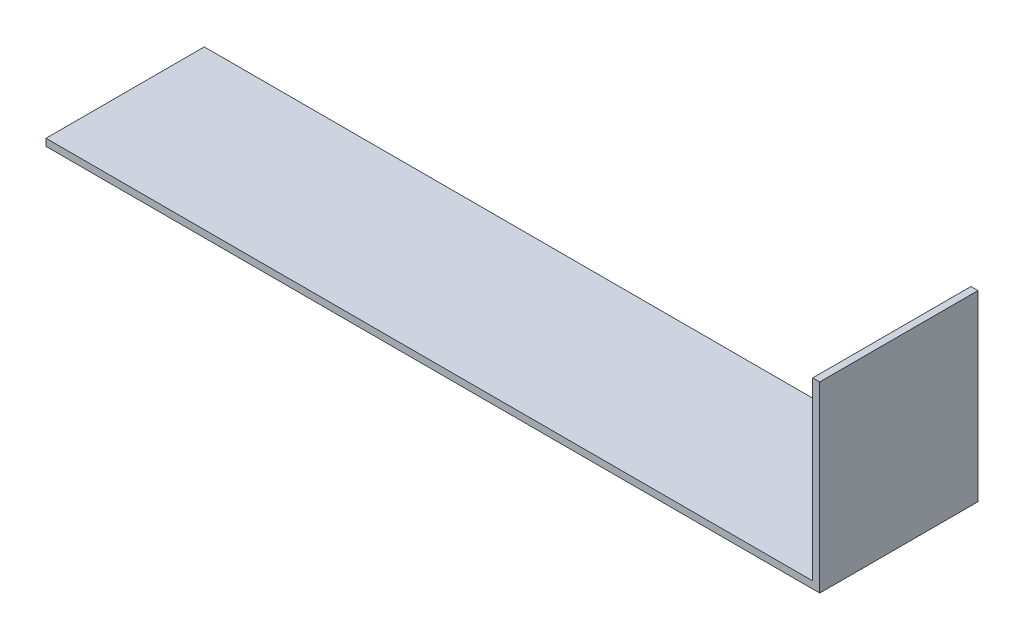
ISO-10303-21;
HEADER;
FILE_DESCRIPTION(('STEP AP214'),'2;1');
FILE_NAME('part.step','',(''),(''),'','','');
FILE_SCHEMA(('AUTOMOTIVE_DESIGN { 1 0 10303 214 1 1 1 1 }'));
ENDSEC;
DATA;
#1=APPLICATION_CONTEXT('core data for automotive mechanical design processes');
#2=APPLICATION_PROTOCOL_DEFINITION('international standard','automotive_design',2000,#1);
#3=PRODUCT_CONTEXT('',#1,'mechanical');
#4=PRODUCT('Part','Part','',(#3));
#5=PRODUCT_RELATED_PRODUCT_CATEGORY('part','',(#4));
#6=PRODUCT_DEFINITION_FORMATION('','',#4);
#7=PRODUCT_DEFINITION_CONTEXT('part definition',#1,'design');
#8=PRODUCT_DEFINITION('design','',#6,#7);
#9=PRODUCT_DEFINITION_SHAPE('','',#8);
#10=(LENGTH_UNIT() NAMED_UNIT(*) SI_UNIT(.MILLI.,.METRE.));
#11=(NAMED_UNIT(*) PLANE_ANGLE_UNIT() SI_UNIT($,.RADIAN.));
#12=(NAMED_UNIT(*) SI_UNIT($,.STERADIAN.) SOLID_ANGLE_UNIT());
#13=UNCERTAINTY_MEASURE_WITH_UNIT(LENGTH_MEASURE(1.E-05),#10,'distance_accuracy_value','');
#14=(GEOMETRIC_REPRESENTATION_CONTEXT(3) GLOBAL_UNCERTAINTY_ASSIGNED_CONTEXT((#13)) GLOBAL_UNIT_ASSIGNED_CONTEXT((#10,
#11,#12)) REPRESENTATION_CONTEXT('',''));
#15=CARTESIAN_POINT('',(0.,0.,0.));
#16=DIRECTION('',(0.,0.,1.));
#17=DIRECTION('',(1.,0.,0.));
#18=AXIS2_PLACEMENT_3D('',#15,#16,#17);
#19=CARTESIAN_POINT('',(-110.,2.,22.5));
#20=DIRECTION('',(1.,0.,0.));
#21=DIRECTION('',(0.,0.,-1.));
#22=AXIS2_PLACEMENT_3D('',#19,#20,#21);
#23=PLANE('',#22);
#24=DIRECTION('',(0.,0.,1.));
#25=VECTOR('',#24,1.);
#26=CARTESIAN_POINT('',(-110.,0.,22.5));
#27=LINE('',#26,#25);
#28=CARTESIAN_POINT('',(-110.,0.,-22.5));
#29=VERTEX_POINT('',#28);
#30=CARTESIAN_POINT('',(-110.,0.,22.5));
#31=VERTEX_POINT('',#30);
#32=EDGE_CURVE('E91',#29,#31,#27,.T.);
#33=ORIENTED_EDGE('',*,*,#32,.T.);
#34=DIRECTION('',(0.,-1.,0.));
#35=VECTOR('',#34,1.);
#36=CARTESIAN_POINT('',(-110.,2.,22.5));
#37=LINE('',#36,#35);
#38=CARTESIAN_POINT('',(-110.,2.,22.5));
#39=VERTEX_POINT('',#38);
#40=EDGE_CURVE('E11',#39,#31,#37,.T.);
#41=ORIENTED_EDGE('',*,*,#40,.F.);
#42=DIRECTION('',(0.,0.,1.));
#43=VECTOR('',#42,1.);
#44=CARTESIAN_POINT('',(-110.,2.,22.5));
#45=LINE('',#44,#43);
#46=CARTESIAN_POINT('',(-110.,2.,-22.5));
#47=VERTEX_POINT('',#46);
#48=EDGE_CURVE('E85',#47,#39,#45,.T.);
#49=ORIENTED_EDGE('',*,*,#48,.F.);
#50=DIRECTION('',(0.,-1.,0.));
#51=VECTOR('',#50,1.);
#52=CARTESIAN_POINT('',(-110.,2.,-22.5));
#53=LINE('',#52,#51);
#54=EDGE_CURVE('E77',#47,#29,#53,.T.);
#55=ORIENTED_EDGE('',*,*,#54,.T.);
#56=EDGE_LOOP('',(#33,#41,#49,#55));
#57=FACE_BOUND('',#56,.T.);
#58=ADVANCED_FACE('F35',(#57),#23,.F.);
#59=CARTESIAN_POINT('',(110.,2.,22.5));
#60=DIRECTION('',(0.,0.,-1.));
#61=DIRECTION('',(-1.,0.,0.));
#62=AXIS2_PLACEMENT_3D('',#59,#60,#61);
#63=PLANE('',#62);
#64=DIRECTION('',(1.,0.,0.));
#65=VECTOR('',#64,1.);
#66=CARTESIAN_POINT('',(110.,0.,22.5));
#67=LINE('',#66,#65);
#68=CARTESIAN_POINT('',(110.,0.,22.5));
#69=VERTEX_POINT('',#68);
#70=EDGE_CURVE('E94',#31,#69,#67,.T.);
#71=ORIENTED_EDGE('',*,*,#70,.T.);
#72=DIRECTION('',(0.,-1.,0.));
#73=VECTOR('',#72,1.);
#74=CARTESIAN_POINT('',(110.,2.,22.5));
#75=LINE('',#74,#73);
#76=CARTESIAN_POINT('',(110.,52.,22.5));
#77=VERTEX_POINT('',#76);
#78=EDGE_CURVE('E42',#77,#69,#75,.T.);
#79=ORIENTED_EDGE('',*,*,#78,.F.);
#80=DIRECTION('',(1.,0.,0.));
#81=VECTOR('',#80,1.);
#82=CARTESIAN_POINT('',(110.,52.,22.5));
#83=LINE('',#82,#81);
#84=CARTESIAN_POINT('',(108.,52.,22.5));
#85=VERTEX_POINT('',#84);
#86=EDGE_CURVE('E118',#85,#77,#83,.T.);
#87=ORIENTED_EDGE('',*,*,#86,.F.);
#88=DIRECTION('',(0.,-1.,0.));
#89=VECTOR('',#88,1.);
#90=CARTESIAN_POINT('',(108.,52.,22.5));
#91=LINE('',#90,#89);
#92=CARTESIAN_POINT('',(108.,2.,22.5));
#93=VERTEX_POINT('',#92);
#94=EDGE_CURVE('E99',#85,#93,#91,.T.);
#95=ORIENTED_EDGE('',*,*,#94,.T.);
#96=DIRECTION('',(1.,0.,0.));
#97=VECTOR('',#96,1.);
#98=CARTESIAN_POINT('',(110.,2.,22.5));
#99=LINE('',#98,#97);
#100=EDGE_CURVE('E135',#39,#93,#99,.T.);
#101=ORIENTED_EDGE('',*,*,#100,.F.);
#102=ORIENTED_EDGE('',*,*,#40,.T.);
#103=EDGE_LOOP('',(#71,#79,#87,#95,#101,#102));
#104=FACE_BOUND('',#103,.T.);
#105=ADVANCED_FACE('F115',(#104),#63,.F.);
#106=CARTESIAN_POINT('',(110.,2.,22.5));
#107=DIRECTION('',(-1.,0.,0.));
#108=DIRECTION('',(0.,0.,1.));
#109=AXIS2_PLACEMENT_3D('',#106,#107,#108);
#110=PLANE('',#109);
#111=DIRECTION('',(0.,0.,-1.));
#112=VECTOR('',#111,1.);
#113=CARTESIAN_POINT('',(110.,0.,22.5));
#114=LINE('',#113,#112);
#115=CARTESIAN_POINT('',(110.,0.,-22.5));
#116=VERTEX_POINT('',#115);
#117=EDGE_CURVE('E86',#69,#116,#114,.T.);
#118=ORIENTED_EDGE('',*,*,#117,.T.);
#119=DIRECTION('',(0.,-1.,0.));
#120=VECTOR('',#119,1.);
#121=CARTESIAN_POINT('',(110.,2.,-22.5));
#122=LINE('',#121,#120);
#123=CARTESIAN_POINT('',(110.,52.,-22.5));
#124=VERTEX_POINT('',#123);
#125=EDGE_CURVE('E81',#124,#116,#122,.T.);
#126=ORIENTED_EDGE('',*,*,#125,.F.);
#127=DIRECTION('',(0.,0.,-1.));
#128=VECTOR('',#127,1.);
#129=CARTESIAN_POINT('',(110.,52.,-22.5));
#130=LINE('',#129,#128);
#131=EDGE_CURVE('E111',#77,#124,#130,.T.);
#132=ORIENTED_EDGE('',*,*,#131,.F.);
#133=ORIENTED_EDGE('',*,*,#78,.T.);
#134=EDGE_LOOP('',(#118,#126,#132,#133));
#135=FACE_BOUND('',#134,.T.);
#136=ADVANCED_FACE('F109',(#135),#110,.F.);
#137=CARTESIAN_POINT('',(110.,2.,-22.5));
#138=DIRECTION('',(0.,0.,1.));
#139=DIRECTION('',(1.,0.,0.));
#140=AXIS2_PLACEMENT_3D('',#137,#138,#139);
#141=PLANE('',#140);
#142=DIRECTION('',(-1.,0.,0.));
#143=VECTOR('',#142,1.);
#144=CARTESIAN_POINT('',(110.,0.,-22.5));
#145=LINE('',#144,#143);
#146=EDGE_CURVE('E74',#116,#29,#145,.T.);
#147=ORIENTED_EDGE('',*,*,#146,.T.);
#148=ORIENTED_EDGE('',*,*,#54,.F.);
#149=DIRECTION('',(-1.,0.,0.));
#150=VECTOR('',#149,1.);
#151=CARTESIAN_POINT('',(110.,2.,-22.5));
#152=LINE('',#151,#150);
#153=CARTESIAN_POINT('',(108.,2.,-22.5));
#154=VERTEX_POINT('',#153);
#155=EDGE_CURVE('E54',#154,#47,#152,.T.);
#156=ORIENTED_EDGE('',*,*,#155,.F.);
#157=DIRECTION('',(0.,-1.,0.));
#158=VECTOR('',#157,1.);
#159=CARTESIAN_POINT('',(108.,52.,-22.5));
#160=LINE('',#159,#158);
#161=CARTESIAN_POINT('',(108.,52.,-22.5));
#162=VERTEX_POINT('',#161);
#163=EDGE_CURVE('E95',#162,#154,#160,.T.);
#164=ORIENTED_EDGE('',*,*,#163,.F.);
#165=DIRECTION('',(-1.,0.,0.));
#166=VECTOR('',#165,1.);
#167=CARTESIAN_POINT('',(110.,52.,-22.5));
#168=LINE('',#167,#166);
#169=EDGE_CURVE('E130',#124,#162,#168,.T.);
#170=ORIENTED_EDGE('',*,*,#169,.F.);
#171=ORIENTED_EDGE('',*,*,#125,.T.);
#172=EDGE_LOOP('',(#147,#148,#156,#164,#170,#171));
#173=FACE_BOUND('',#172,.T.);
#174=ADVANCED_FACE('F76',(#173),#141,.F.);
#175=CARTESIAN_POINT('',(0.,2.,0.));
#176=DIRECTION('',(0.,1.,0.));
#177=DIRECTION('',(0.,0.,1.));
#178=AXIS2_PLACEMENT_3D('',#175,#176,#177);
#179=PLANE('',#178);
#180=DIRECTION('',(0.,0.,1.));
#181=VECTOR('',#180,1.);
#182=CARTESIAN_POINT('',(108.,2.,-22.5));
#183=LINE('',#182,#181);
#184=EDGE_CURVE('E49',#154,#93,#183,.T.);
#185=ORIENTED_EDGE('',*,*,#184,.F.);
#186=ORIENTED_EDGE('',*,*,#155,.T.);
#187=ORIENTED_EDGE('',*,*,#48,.T.);
#188=ORIENTED_EDGE('',*,*,#100,.T.);
#189=EDGE_LOOP('',(#185,#186,#187,#188));
#190=FACE_BOUND('',#189,.T.);
#191=ADVANCED_FACE('F137',(#190),#179,.T.);
#192=CARTESIAN_POINT('',(0.,0.,0.));
#193=DIRECTION('',(0.,1.,0.));
#194=DIRECTION('',(0.,0.,1.));
#195=AXIS2_PLACEMENT_3D('',#192,#193,#194);
#196=PLANE('',#195);
#197=ORIENTED_EDGE('',*,*,#32,.F.);
#198=ORIENTED_EDGE('',*,*,#146,.F.);
#199=ORIENTED_EDGE('',*,*,#117,.F.);
#200=ORIENTED_EDGE('',*,*,#70,.F.);
#201=EDGE_LOOP('',(#197,#198,#199,#200));
#202=FACE_BOUND('',#201,.T.);
#203=ADVANCED_FACE('F93',(#202),#196,.F.);
#204=CARTESIAN_POINT('',(108.,52.,-22.5));
#205=DIRECTION('',(1.,0.,0.));
#206=DIRECTION('',(0.,0.,-1.));
#207=AXIS2_PLACEMENT_3D('',#204,#205,#206);
#208=PLANE('',#207);
#209=ORIENTED_EDGE('',*,*,#184,.T.);
#210=ORIENTED_EDGE('',*,*,#94,.F.);
#211=DIRECTION('',(0.,0.,1.));
#212=VECTOR('',#211,1.);
#213=CARTESIAN_POINT('',(108.,52.,-22.5));
#214=LINE('',#213,#212);
#215=EDGE_CURVE('E126',#162,#85,#214,.T.);
#216=ORIENTED_EDGE('',*,*,#215,.F.);
#217=ORIENTED_EDGE('',*,*,#163,.T.);
#218=EDGE_LOOP('',(#209,#210,#216,#217));
#219=FACE_BOUND('',#218,.T.);
#220=ADVANCED_FACE('F139',(#219),#208,.F.);
#221=CARTESIAN_POINT('',(0.,52.,0.));
#222=DIRECTION('',(0.,-1.,0.));
#223=DIRECTION('',(0.,0.,-1.));
#224=AXIS2_PLACEMENT_3D('',#221,#222,#223);
#225=PLANE('',#224);
#226=ORIENTED_EDGE('',*,*,#131,.T.);
#227=ORIENTED_EDGE('',*,*,#169,.T.);
#228=ORIENTED_EDGE('',*,*,#215,.T.);
#229=ORIENTED_EDGE('',*,*,#86,.T.);
#230=EDGE_LOOP('',(#226,#227,#228,#229));
#231=FACE_BOUND('',#230,.T.);
#232=ADVANCED_FACE('F122',(#231),#225,.F.);
#233=CLOSED_SHELL('',(#58,#105,#136,#174,#191,#203,#220,#232));
#234=MANIFOLD_SOLID_BREP('B2',#233);
#235=ADVANCED_BREP_SHAPE_REPRESENTATION('',(#18,#234),#14);
#236=SHAPE_DEFINITION_REPRESENTATION(#9,#235);
ENDSEC;
END-ISO-10303-21;
